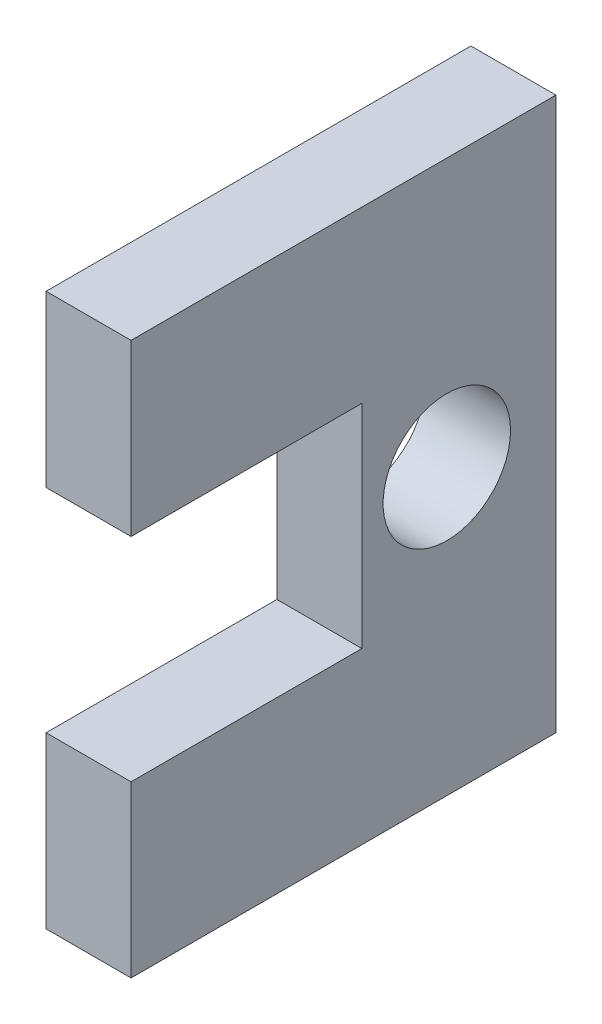
ISO-10303-21;
HEADER;
FILE_DESCRIPTION(('STEP AP214'),'2;1');
FILE_NAME('part.step','',(''),(''),'','','');
FILE_SCHEMA(('AUTOMOTIVE_DESIGN { 1 0 10303 214 1 1 1 1 }'));
ENDSEC;
DATA;
#1=APPLICATION_CONTEXT('core data for automotive mechanical design processes');
#2=APPLICATION_PROTOCOL_DEFINITION('international standard','automotive_design',2000,#1);
#3=PRODUCT_CONTEXT('',#1,'mechanical');
#4=PRODUCT('Part','Part','',(#3));
#5=PRODUCT_RELATED_PRODUCT_CATEGORY('part','',(#4));
#6=PRODUCT_DEFINITION_FORMATION('','',#4);
#7=PRODUCT_DEFINITION_CONTEXT('part definition',#1,'design');
#8=PRODUCT_DEFINITION('design','',#6,#7);
#9=PRODUCT_DEFINITION_SHAPE('','',#8);
#10=(LENGTH_UNIT() NAMED_UNIT(*) SI_UNIT(.MILLI.,.METRE.));
#11=(NAMED_UNIT(*) PLANE_ANGLE_UNIT() SI_UNIT($,.RADIAN.));
#12=(NAMED_UNIT(*) SI_UNIT($,.STERADIAN.) SOLID_ANGLE_UNIT());
#13=UNCERTAINTY_MEASURE_WITH_UNIT(LENGTH_MEASURE(1.E-05),#10,'distance_accuracy_value','');
#14=(GEOMETRIC_REPRESENTATION_CONTEXT(3) GLOBAL_UNCERTAINTY_ASSIGNED_CONTEXT((#13)) GLOBAL_UNIT_ASSIGNED_CONTEXT((#10,
#11,#12)) REPRESENTATION_CONTEXT('',''));
#15=CARTESIAN_POINT('',(0.,0.,0.));
#16=DIRECTION('',(0.,0.,1.));
#17=DIRECTION('',(1.,0.,0.));
#18=AXIS2_PLACEMENT_3D('',#15,#16,#17);
#19=CARTESIAN_POINT('',(2.,0.,0.));
#20=DIRECTION('',(1.,0.,0.));
#21=DIRECTION('',(0.,0.,-1.));
#22=AXIS2_PLACEMENT_3D('',#19,#20,#21);
#23=PLANE('',#22);
#24=DIRECTION('',(0.,1.,0.));
#25=VECTOR('',#24,1.);
#26=CARTESIAN_POINT('',(2.,-10.9714993699869,-5.));
#27=LINE('',#26,#25);
#28=CARTESIAN_POINT('',(2.,-10.9714993699869,-5.));
#29=VERTEX_POINT('',#28);
#30=CARTESIAN_POINT('',(2.,2.02702702702703,-5.));
#31=VERTEX_POINT('',#30);
#32=EDGE_CURVE('E145',#29,#31,#27,.T.);
#33=ORIENTED_EDGE('',*,*,#32,.T.);
#34=DIRECTION('',(0.,0.,1.));
#35=VECTOR('',#34,1.);
#36=CARTESIAN_POINT('',(2.,2.02702702702703,-5.));
#37=LINE('',#36,#35);
#38=CARTESIAN_POINT('',(2.,2.02702702702703,5.));
#39=VERTEX_POINT('',#38);
#40=EDGE_CURVE('E93',#31,#39,#37,.T.);
#41=ORIENTED_EDGE('',*,*,#40,.T.);
#42=DIRECTION('',(0.,-1.,0.));
#43=VECTOR('',#42,1.);
#44=CARTESIAN_POINT('',(2.,-1.97297297297297,5.));
#45=LINE('',#44,#43);
#46=CARTESIAN_POINT('',(2.,-1.97297297297297,5.));
#47=VERTEX_POINT('',#46);
#48=EDGE_CURVE('E160',#39,#47,#45,.T.);
#49=ORIENTED_EDGE('',*,*,#48,.T.);
#50=DIRECTION('',(0.,0.,-1.));
#51=VECTOR('',#50,1.);
#52=CARTESIAN_POINT('',(2.,-1.97297297297297,-0.432432432432427));
#53=LINE('',#52,#51);
#54=CARTESIAN_POINT('',(2.,-1.97297297297297,-0.432432432432427));
#55=VERTEX_POINT('',#54);
#56=EDGE_CURVE('E173',#47,#55,#53,.T.);
#57=ORIENTED_EDGE('',*,*,#56,.T.);
#58=DIRECTION('',(0.,-1.,0.));
#59=VECTOR('',#58,1.);
#60=CARTESIAN_POINT('',(2.,-6.97149936998687,-0.432432432432427));
#61=LINE('',#60,#59);
#62=CARTESIAN_POINT('',(2.,-6.97149936998687,-0.432432432432427));
#63=VERTEX_POINT('',#62);
#64=EDGE_CURVE('E112',#55,#63,#61,.T.);
#65=ORIENTED_EDGE('',*,*,#64,.T.);
#66=DIRECTION('',(0.,0.,1.));
#67=VECTOR('',#66,1.);
#68=CARTESIAN_POINT('',(2.,-6.97149936998687,-0.432432432432427));
#69=LINE('',#68,#67);
#70=CARTESIAN_POINT('',(2.,-6.97149936998687,5.));
#71=VERTEX_POINT('',#70);
#72=EDGE_CURVE('E106',#63,#71,#69,.T.);
#73=ORIENTED_EDGE('',*,*,#72,.T.);
#74=DIRECTION('',(0.,-1.,0.));
#75=VECTOR('',#74,1.);
#76=CARTESIAN_POINT('',(2.,-10.9714993699869,5.));
#77=LINE('',#76,#75);
#78=CARTESIAN_POINT('',(2.,-10.9714993699869,5.));
#79=VERTEX_POINT('',#78);
#80=EDGE_CURVE('E110',#71,#79,#77,.T.);
#81=ORIENTED_EDGE('',*,*,#80,.T.);
#82=DIRECTION('',(0.,0.,-1.));
#83=VECTOR('',#82,1.);
#84=CARTESIAN_POINT('',(2.,-10.9714993699869,-5.));
#85=LINE('',#84,#83);
#86=EDGE_CURVE('E50',#79,#29,#85,.T.);
#87=ORIENTED_EDGE('',*,*,#86,.T.);
#88=EDGE_LOOP('',(#33,#41,#49,#57,#65,#73,#81,#87));
#89=FACE_BOUND('',#88,.T.);
#90=CARTESIAN_POINT('',(2.,-4.27297297297297,-2.43243243243243));
#91=DIRECTION('',(1.,0.,0.));
#92=DIRECTION('',(0.,0.,-1.));
#93=AXIS2_PLACEMENT_3D('',#90,#91,#92);
#94=CIRCLE('',#93,1.5);
#95=CARTESIAN_POINT('',(2.,-4.27297297297297,-3.93243243243243));
#96=VERTEX_POINT('',#95);
#97=EDGE_CURVE('E134',#96,#96,#94,.T.);
#98=ORIENTED_EDGE('',*,*,#97,.F.);
#99=EDGE_LOOP('',(#98));
#100=FACE_BOUND('',#99,.T.);
#101=ADVANCED_FACE('F33',(#89,#100),#23,.T.);
#102=CARTESIAN_POINT('',(0.,0.,0.));
#103=DIRECTION('',(1.,0.,0.));
#104=DIRECTION('',(0.,0.,-1.));
#105=AXIS2_PLACEMENT_3D('',#102,#103,#104);
#106=PLANE('',#105);
#107=DIRECTION('',(0.,1.,0.));
#108=VECTOR('',#107,1.);
#109=CARTESIAN_POINT('',(0.,-10.9714993699869,-5.));
#110=LINE('',#109,#108);
#111=CARTESIAN_POINT('',(0.,-10.9714993699869,-5.));
#112=VERTEX_POINT('',#111);
#113=CARTESIAN_POINT('',(0.,2.02702702702703,-5.));
#114=VERTEX_POINT('',#113);
#115=EDGE_CURVE('E130',#112,#114,#110,.T.);
#116=ORIENTED_EDGE('',*,*,#115,.F.);
#117=DIRECTION('',(0.,0.,-1.));
#118=VECTOR('',#117,1.);
#119=CARTESIAN_POINT('',(0.,-10.9714993699869,-5.));
#120=LINE('',#119,#118);
#121=CARTESIAN_POINT('',(0.,-10.9714993699869,5.));
#122=VERTEX_POINT('',#121);
#123=EDGE_CURVE('E85',#122,#112,#120,.T.);
#124=ORIENTED_EDGE('',*,*,#123,.F.);
#125=DIRECTION('',(0.,-1.,0.));
#126=VECTOR('',#125,1.);
#127=CARTESIAN_POINT('',(0.,-10.9714993699869,5.));
#128=LINE('',#127,#126);
#129=CARTESIAN_POINT('',(0.,-6.97149936998687,5.));
#130=VERTEX_POINT('',#129);
#131=EDGE_CURVE('E79',#130,#122,#128,.T.);
#132=ORIENTED_EDGE('',*,*,#131,.F.);
#133=DIRECTION('',(0.,0.,1.));
#134=VECTOR('',#133,1.);
#135=CARTESIAN_POINT('',(0.,-6.97149936998687,-0.432432432432427));
#136=LINE('',#135,#134);
#137=CARTESIAN_POINT('',(0.,-6.97149936998687,-0.432432432432427));
#138=VERTEX_POINT('',#137);
#139=EDGE_CURVE('E120',#138,#130,#136,.T.);
#140=ORIENTED_EDGE('',*,*,#139,.F.);
#141=DIRECTION('',(0.,-1.,0.));
#142=VECTOR('',#141,1.);
#143=CARTESIAN_POINT('',(0.,-6.97149936998687,-0.432432432432427));
#144=LINE('',#143,#142);
#145=CARTESIAN_POINT('',(0.,-1.97297297297297,-0.432432432432427));
#146=VERTEX_POINT('',#145);
#147=EDGE_CURVE('E140',#146,#138,#144,.T.);
#148=ORIENTED_EDGE('',*,*,#147,.F.);
#149=DIRECTION('',(0.,0.,-1.));
#150=VECTOR('',#149,1.);
#151=CARTESIAN_POINT('',(0.,-1.97297297297297,-0.432432432432427));
#152=LINE('',#151,#150);
#153=CARTESIAN_POINT('',(0.,-1.97297297297297,5.));
#154=VERTEX_POINT('',#153);
#155=EDGE_CURVE('E138',#154,#146,#152,.T.);
#156=ORIENTED_EDGE('',*,*,#155,.F.);
#157=DIRECTION('',(0.,-1.,0.));
#158=VECTOR('',#157,1.);
#159=CARTESIAN_POINT('',(0.,-1.97297297297297,5.));
#160=LINE('',#159,#158);
#161=CARTESIAN_POINT('',(0.,2.02702702702703,5.));
#162=VERTEX_POINT('',#161);
#163=EDGE_CURVE('E136',#162,#154,#160,.T.);
#164=ORIENTED_EDGE('',*,*,#163,.F.);
#165=DIRECTION('',(0.,0.,1.));
#166=VECTOR('',#165,1.);
#167=CARTESIAN_POINT('',(0.,2.02702702702703,-5.));
#168=LINE('',#167,#166);
#169=EDGE_CURVE('E133',#114,#162,#168,.T.);
#170=ORIENTED_EDGE('',*,*,#169,.F.);
#171=EDGE_LOOP('',(#116,#124,#132,#140,#148,#156,#164,#170));
#172=FACE_BOUND('',#171,.T.);
#173=CARTESIAN_POINT('',(0.,-4.27297297297297,-2.43243243243243));
#174=DIRECTION('',(1.,0.,0.));
#175=DIRECTION('',(0.,0.,-1.));
#176=AXIS2_PLACEMENT_3D('',#173,#174,#175);
#177=CIRCLE('',#176,1.5);
#178=CARTESIAN_POINT('',(0.,-4.27297297297297,-3.93243243243243));
#179=VERTEX_POINT('',#178);
#180=EDGE_CURVE('E179',#179,#179,#177,.T.);
#181=ORIENTED_EDGE('',*,*,#180,.T.);
#182=EDGE_LOOP('',(#181));
#183=FACE_BOUND('',#182,.T.);
#184=ADVANCED_FACE('F164',(#172,#183),#106,.F.);
#185=CARTESIAN_POINT('',(2.,-10.9714993699869,-5.));
#186=DIRECTION('',(0.,0.,1.));
#187=DIRECTION('',(1.,0.,0.));
#188=AXIS2_PLACEMENT_3D('',#185,#186,#187);
#189=PLANE('',#188);
#190=ORIENTED_EDGE('',*,*,#115,.T.);
#191=DIRECTION('',(-1.,0.,0.));
#192=VECTOR('',#191,1.);
#193=CARTESIAN_POINT('',(2.,2.02702702702703,-5.));
#194=LINE('',#193,#192);
#195=EDGE_CURVE('E11',#31,#114,#194,.T.);
#196=ORIENTED_EDGE('',*,*,#195,.F.);
#197=ORIENTED_EDGE('',*,*,#32,.F.);
#198=DIRECTION('',(-1.,0.,0.));
#199=VECTOR('',#198,1.);
#200=CARTESIAN_POINT('',(2.,-10.9714993699869,-5.));
#201=LINE('',#200,#199);
#202=EDGE_CURVE('E126',#29,#112,#201,.T.);
#203=ORIENTED_EDGE('',*,*,#202,.T.);
#204=EDGE_LOOP('',(#190,#196,#197,#203));
#205=FACE_BOUND('',#204,.T.);
#206=ADVANCED_FACE('F35',(#205),#189,.F.);
#207=CARTESIAN_POINT('',(2.,2.02702702702703,-5.));
#208=DIRECTION('',(0.,-1.,0.));
#209=DIRECTION('',(0.,0.,-1.));
#210=AXIS2_PLACEMENT_3D('',#207,#208,#209);
#211=PLANE('',#210);
#212=ORIENTED_EDGE('',*,*,#169,.T.);
#213=DIRECTION('',(-1.,0.,0.));
#214=VECTOR('',#213,1.);
#215=CARTESIAN_POINT('',(2.,2.02702702702703,5.));
#216=LINE('',#215,#214);
#217=EDGE_CURVE('E42',#39,#162,#216,.T.);
#218=ORIENTED_EDGE('',*,*,#217,.F.);
#219=ORIENTED_EDGE('',*,*,#40,.F.);
#220=ORIENTED_EDGE('',*,*,#195,.T.);
#221=EDGE_LOOP('',(#212,#218,#219,#220));
#222=FACE_BOUND('',#221,.T.);
#223=ADVANCED_FACE('F207',(#222),#211,.F.);
#224=CARTESIAN_POINT('',(2.,-1.97297297297297,5.));
#225=DIRECTION('',(0.,0.,-1.));
#226=DIRECTION('',(0.,1.,0.));
#227=AXIS2_PLACEMENT_3D('',#224,#225,#226);
#228=PLANE('',#227);
#229=ORIENTED_EDGE('',*,*,#163,.T.);
#230=DIRECTION('',(-1.,0.,0.));
#231=VECTOR('',#230,1.);
#232=CARTESIAN_POINT('',(2.,-1.97297297297297,5.));
#233=LINE('',#232,#231);
#234=EDGE_CURVE('E152',#47,#154,#233,.T.);
#235=ORIENTED_EDGE('',*,*,#234,.F.);
#236=ORIENTED_EDGE('',*,*,#48,.F.);
#237=ORIENTED_EDGE('',*,*,#217,.T.);
#238=EDGE_LOOP('',(#229,#235,#236,#237));
#239=FACE_BOUND('',#238,.T.);
#240=ADVANCED_FACE('F158',(#239),#228,.F.);
#241=CARTESIAN_POINT('',(2.,-1.97297297297297,-0.432432432432427));
#242=DIRECTION('',(0.,1.,0.));
#243=DIRECTION('',(0.,0.,1.));
#244=AXIS2_PLACEMENT_3D('',#241,#242,#243);
#245=PLANE('',#244);
#246=ORIENTED_EDGE('',*,*,#155,.T.);
#247=DIRECTION('',(-1.,0.,0.));
#248=VECTOR('',#247,1.);
#249=CARTESIAN_POINT('',(2.,-1.97297297297297,-0.432432432432427));
#250=LINE('',#249,#248);
#251=EDGE_CURVE('E149',#55,#146,#250,.T.);
#252=ORIENTED_EDGE('',*,*,#251,.F.);
#253=ORIENTED_EDGE('',*,*,#56,.F.);
#254=ORIENTED_EDGE('',*,*,#234,.T.);
#255=EDGE_LOOP('',(#246,#252,#253,#254));
#256=FACE_BOUND('',#255,.T.);
#257=ADVANCED_FACE('F169',(#256),#245,.F.);
#258=CARTESIAN_POINT('',(2.,-6.97149936998687,-0.432432432432427));
#259=DIRECTION('',(0.,0.,-1.));
#260=DIRECTION('',(0.,1.,0.));
#261=AXIS2_PLACEMENT_3D('',#258,#259,#260);
#262=PLANE('',#261);
#263=ORIENTED_EDGE('',*,*,#147,.T.);
#264=DIRECTION('',(-1.,0.,0.));
#265=VECTOR('',#264,1.);
#266=CARTESIAN_POINT('',(2.,-6.97149936998687,-0.432432432432427));
#267=LINE('',#266,#265);
#268=EDGE_CURVE('E121',#63,#138,#267,.T.);
#269=ORIENTED_EDGE('',*,*,#268,.F.);
#270=ORIENTED_EDGE('',*,*,#64,.F.);
#271=ORIENTED_EDGE('',*,*,#251,.T.);
#272=EDGE_LOOP('',(#263,#269,#270,#271));
#273=FACE_BOUND('',#272,.T.);
#274=ADVANCED_FACE('F172',(#273),#262,.F.);
#275=CARTESIAN_POINT('',(2.,-6.97149936998687,-0.432432432432427));
#276=DIRECTION('',(0.,-1.,0.));
#277=DIRECTION('',(0.,0.,-1.));
#278=AXIS2_PLACEMENT_3D('',#275,#276,#277);
#279=PLANE('',#278);
#280=ORIENTED_EDGE('',*,*,#139,.T.);
#281=DIRECTION('',(-1.,0.,0.));
#282=VECTOR('',#281,1.);
#283=CARTESIAN_POINT('',(2.,-6.97149936998687,5.));
#284=LINE('',#283,#282);
#285=EDGE_CURVE('E117',#71,#130,#284,.T.);
#286=ORIENTED_EDGE('',*,*,#285,.F.);
#287=ORIENTED_EDGE('',*,*,#72,.F.);
#288=ORIENTED_EDGE('',*,*,#268,.T.);
#289=EDGE_LOOP('',(#280,#286,#287,#288));
#290=FACE_BOUND('',#289,.T.);
#291=ADVANCED_FACE('F118',(#290),#279,.F.);
#292=CARTESIAN_POINT('',(2.,-10.9714993699869,5.));
#293=DIRECTION('',(0.,0.,-1.));
#294=DIRECTION('',(0.,1.,0.));
#295=AXIS2_PLACEMENT_3D('',#292,#293,#294);
#296=PLANE('',#295);
#297=ORIENTED_EDGE('',*,*,#131,.T.);
#298=DIRECTION('',(-1.,0.,0.));
#299=VECTOR('',#298,1.);
#300=CARTESIAN_POINT('',(2.,-10.9714993699869,5.));
#301=LINE('',#300,#299);
#302=EDGE_CURVE('E122',#79,#122,#301,.T.);
#303=ORIENTED_EDGE('',*,*,#302,.F.);
#304=ORIENTED_EDGE('',*,*,#80,.F.);
#305=ORIENTED_EDGE('',*,*,#285,.T.);
#306=EDGE_LOOP('',(#297,#303,#304,#305));
#307=FACE_BOUND('',#306,.T.);
#308=ADVANCED_FACE('F124',(#307),#296,.F.);
#309=CARTESIAN_POINT('',(2.,-10.9714993699869,-5.));
#310=DIRECTION('',(0.,1.,0.));
#311=DIRECTION('',(0.,0.,1.));
#312=AXIS2_PLACEMENT_3D('',#309,#310,#311);
#313=PLANE('',#312);
#314=ORIENTED_EDGE('',*,*,#123,.T.);
#315=ORIENTED_EDGE('',*,*,#202,.F.);
#316=ORIENTED_EDGE('',*,*,#86,.F.);
#317=ORIENTED_EDGE('',*,*,#302,.T.);
#318=EDGE_LOOP('',(#314,#315,#316,#317));
#319=FACE_BOUND('',#318,.T.);
#320=ADVANCED_FACE('F195',(#319),#313,.F.);
#321=CARTESIAN_POINT('',(2.,-4.27297297297297,-2.43243243243243));
#322=DIRECTION('',(-1.,0.,0.));
#323=DIRECTION('',(0.,0.,1.));
#324=AXIS2_PLACEMENT_3D('',#321,#322,#323);
#325=CYLINDRICAL_SURFACE('',#324,1.5);
#326=ORIENTED_EDGE('',*,*,#97,.T.);
#327=EDGE_LOOP('',(#326));
#328=FACE_BOUND('',#327,.T.);
#329=ORIENTED_EDGE('',*,*,#180,.F.);
#330=EDGE_LOOP('',(#329));
#331=FACE_BOUND('',#330,.T.);
#332=ADVANCED_FACE('F185',(#328,#331),#325,.F.);
#333=CLOSED_SHELL('',(#101,#184,#206,#223,#240,#257,#274,#291,#308,#320,#332));
#334=MANIFOLD_SOLID_BREP('B2',#333);
#335=ADVANCED_BREP_SHAPE_REPRESENTATION('',(#18,#334),#14);
#336=SHAPE_DEFINITION_REPRESENTATION(#9,#335);
ENDSEC;
END-ISO-10303-21;
